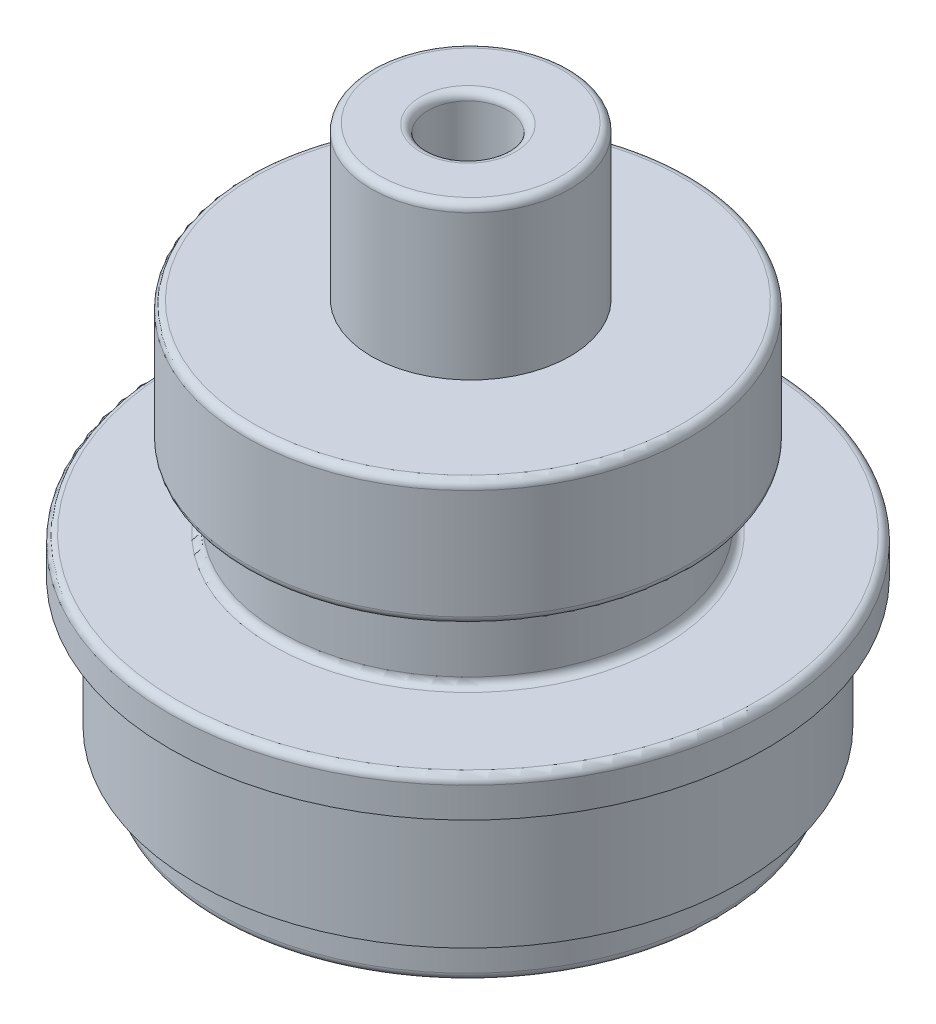
ISO-10303-21;
HEADER;
FILE_DESCRIPTION(('STEP AP214'),'2;1');
FILE_NAME('part.step','',(''),(''),'','','');
FILE_SCHEMA(('AUTOMOTIVE_DESIGN { 1 0 10303 214 1 1 1 1 }'));
ENDSEC;
DATA;
#1=APPLICATION_CONTEXT('core data for automotive mechanical design processes');
#2=APPLICATION_PROTOCOL_DEFINITION('international standard','automotive_design',2000,#1);
#3=PRODUCT_CONTEXT('',#1,'mechanical');
#4=PRODUCT('Part','Part','',(#3));
#5=PRODUCT_RELATED_PRODUCT_CATEGORY('part','',(#4));
#6=PRODUCT_DEFINITION_FORMATION('','',#4);
#7=PRODUCT_DEFINITION_CONTEXT('part definition',#1,'design');
#8=PRODUCT_DEFINITION('design','',#6,#7);
#9=PRODUCT_DEFINITION_SHAPE('','',#8);
#10=(LENGTH_UNIT() NAMED_UNIT(*) SI_UNIT(.MILLI.,.METRE.));
#11=(NAMED_UNIT(*) PLANE_ANGLE_UNIT() SI_UNIT($,.RADIAN.));
#12=(NAMED_UNIT(*) SI_UNIT($,.STERADIAN.) SOLID_ANGLE_UNIT());
#13=UNCERTAINTY_MEASURE_WITH_UNIT(LENGTH_MEASURE(1.E-05),#10,'distance_accuracy_value','');
#14=(GEOMETRIC_REPRESENTATION_CONTEXT(3) GLOBAL_UNCERTAINTY_ASSIGNED_CONTEXT((#13)) GLOBAL_UNIT_ASSIGNED_CONTEXT((#10,
#11,#12)) REPRESENTATION_CONTEXT('',''));
#15=CARTESIAN_POINT('',(0.,0.,0.));
#16=DIRECTION('',(0.,0.,1.));
#17=DIRECTION('',(1.,0.,0.));
#18=AXIS2_PLACEMENT_3D('',#15,#16,#17);
#19=CARTESIAN_POINT('',(0.,4.8514,0.));
#20=DIRECTION('',(0.,-1.,0.));
#21=DIRECTION('',(0.,0.,-1.));
#22=AXIS2_PLACEMENT_3D('',#19,#20,#21);
#23=CYLINDRICAL_SURFACE('',#22,38.1);
#24=CARTESIAN_POINT('',(0.,3.8514,0.));
#25=DIRECTION('',(0.,1.,0.));
#26=DIRECTION('',(0.,0.,1.));
#27=AXIS2_PLACEMENT_3D('',#24,#25,#26);
#28=CIRCLE('',#27,38.1);
#29=CARTESIAN_POINT('',(0.,3.8514,38.1));
#30=VERTEX_POINT('',#29);
#31=EDGE_CURVE('E83',#30,#30,#28,.F.);
#32=ORIENTED_EDGE('',*,*,#31,.T.);
#33=EDGE_LOOP('',(#32));
#34=FACE_BOUND('',#33,.T.);
#35=CARTESIAN_POINT('',(0.,0.,0.));
#36=DIRECTION('',(0.,1.,0.));
#37=DIRECTION('',(0.,0.,1.));
#38=AXIS2_PLACEMENT_3D('',#35,#36,#37);
#39=CIRCLE('',#38,38.1);
#40=CARTESIAN_POINT('',(0.,0.,38.1));
#41=VERTEX_POINT('',#40);
#42=EDGE_CURVE('E124',#41,#41,#39,.T.);
#43=ORIENTED_EDGE('',*,*,#42,.T.);
#44=EDGE_LOOP('',(#43));
#45=FACE_BOUND('',#44,.T.);
#46=ADVANCED_FACE('F43',(#34,#45),#23,.T.);
#47=CARTESIAN_POINT('',(0.,4.8514,0.));
#48=DIRECTION('',(0.,1.,0.));
#49=DIRECTION('',(0.,0.,1.));
#50=AXIS2_PLACEMENT_3D('',#47,#48,#49);
#51=PLANE('',#50);
#52=CARTESIAN_POINT('',(0.,4.8514,0.));
#53=DIRECTION('',(0.,1.,0.));
#54=DIRECTION('',(0.,0.,1.));
#55=AXIS2_PLACEMENT_3D('',#52,#53,#54);
#56=CIRCLE('',#55,37.1);
#57=CARTESIAN_POINT('',(0.,4.8514,37.1));
#58=VERTEX_POINT('',#57);
#59=EDGE_CURVE('E87',#58,#58,#56,.T.);
#60=ORIENTED_EDGE('',*,*,#59,.T.);
#61=EDGE_LOOP('',(#60));
#62=FACE_BOUND('',#61,.T.);
#63=CARTESIAN_POINT('',(0.,4.8514,0.));
#64=DIRECTION('',(0.,1.,0.));
#65=DIRECTION('',(0.,0.,1.));
#66=AXIS2_PLACEMENT_3D('',#63,#64,#65);
#67=CIRCLE('',#66,24.9776);
#68=CARTESIAN_POINT('',(0.,4.8514,24.9776));
#69=VERTEX_POINT('',#68);
#70=EDGE_CURVE('E91',#69,#69,#67,.F.);
#71=ORIENTED_EDGE('',*,*,#70,.T.);
#72=EDGE_LOOP('',(#71));
#73=FACE_BOUND('',#72,.T.);
#74=ADVANCED_FACE('F171',(#62,#73),#51,.T.);
#75=CARTESIAN_POINT('',(0.,0.,0.));
#76=DIRECTION('',(0.,1.,0.));
#77=DIRECTION('',(0.,0.,1.));
#78=AXIS2_PLACEMENT_3D('',#75,#76,#77);
#79=PLANE('',#78);
#80=CARTESIAN_POINT('',(0.,0.,0.));
#81=DIRECTION('',(0.,-1.,0.));
#82=DIRECTION('',(0.,0.,-1.));
#83=AXIS2_PLACEMENT_3D('',#80,#81,#82);
#84=CIRCLE('',#83,34.798);
#85=CARTESIAN_POINT('',(0.,0.,-34.798));
#86=VERTEX_POINT('',#85);
#87=EDGE_CURVE('E133',#86,#86,#84,.T.);
#88=ORIENTED_EDGE('',*,*,#87,.F.);
#89=EDGE_LOOP('',(#88));
#90=FACE_BOUND('',#89,.T.);
#91=ORIENTED_EDGE('',*,*,#42,.F.);
#92=EDGE_LOOP('',(#91));
#93=FACE_BOUND('',#92,.T.);
#94=ADVANCED_FACE('F177',(#90,#93),#79,.F.);
#95=CARTESIAN_POINT('',(0.,14.5796,0.));
#96=DIRECTION('',(0.,-1.,0.));
#97=DIRECTION('',(0.,0.,-1.));
#98=AXIS2_PLACEMENT_3D('',#95,#96,#97);
#99=CYLINDRICAL_SURFACE('',#98,23.9776);
#100=CARTESIAN_POINT('',(0.,5.8514,0.));
#101=DIRECTION('',(0.,1.,0.));
#102=DIRECTION('',(0.,0.,1.));
#103=AXIS2_PLACEMENT_3D('',#100,#101,#102);
#104=CIRCLE('',#103,23.9776);
#105=CARTESIAN_POINT('',(0.,5.8514,23.9776));
#106=VERTEX_POINT('',#105);
#107=EDGE_CURVE('E75',#106,#106,#104,.T.);
#108=ORIENTED_EDGE('',*,*,#107,.T.);
#109=EDGE_LOOP('',(#108));
#110=FACE_BOUND('',#109,.T.);
#111=CARTESIAN_POINT('',(0.,13.5796,0.));
#112=DIRECTION('',(0.,1.,0.));
#113=DIRECTION('',(0.,0.,1.));
#114=AXIS2_PLACEMENT_3D('',#111,#112,#113);
#115=CIRCLE('',#114,23.9776);
#116=CARTESIAN_POINT('',(0.,13.5796,23.9776));
#117=VERTEX_POINT('',#116);
#118=EDGE_CURVE('E79',#117,#117,#115,.F.);
#119=ORIENTED_EDGE('',*,*,#118,.T.);
#120=EDGE_LOOP('',(#119));
#121=FACE_BOUND('',#120,.T.);
#122=ADVANCED_FACE('F221',(#110,#121),#99,.T.);
#123=CARTESIAN_POINT('',(0.,30.5816,0.));
#124=DIRECTION('',(0.,-1.,0.));
#125=DIRECTION('',(0.,0.,-1.));
#126=AXIS2_PLACEMENT_3D('',#123,#124,#125);
#127=CYLINDRICAL_SURFACE('',#126,28.3464);
#128=CARTESIAN_POINT('',(0.,15.5796,0.));
#129=DIRECTION('',(0.,1.,0.));
#130=DIRECTION('',(0.,0.,1.));
#131=AXIS2_PLACEMENT_3D('',#128,#129,#130);
#132=CIRCLE('',#131,28.3464);
#133=CARTESIAN_POINT('',(0.,15.5796,28.3464));
#134=VERTEX_POINT('',#133);
#135=EDGE_CURVE('E56',#134,#134,#132,.T.);
#136=ORIENTED_EDGE('',*,*,#135,.T.);
#137=EDGE_LOOP('',(#136));
#138=FACE_BOUND('',#137,.T.);
#139=CARTESIAN_POINT('',(0.,29.5816,0.));
#140=DIRECTION('',(0.,1.,0.));
#141=DIRECTION('',(0.,0.,1.));
#142=AXIS2_PLACEMENT_3D('',#139,#140,#141);
#143=CIRCLE('',#142,28.3464);
#144=CARTESIAN_POINT('',(0.,29.5816,28.3464));
#145=VERTEX_POINT('',#144);
#146=EDGE_CURVE('E61',#145,#145,#143,.F.);
#147=ORIENTED_EDGE('',*,*,#146,.T.);
#148=EDGE_LOOP('',(#147));
#149=FACE_BOUND('',#148,.T.);
#150=ADVANCED_FACE('F218',(#138,#149),#127,.T.);
#151=CARTESIAN_POINT('',(0.,30.5816,0.));
#152=DIRECTION('',(0.,1.,0.));
#153=DIRECTION('',(0.,0.,1.));
#154=AXIS2_PLACEMENT_3D('',#151,#152,#153);
#155=PLANE('',#154);
#156=CARTESIAN_POINT('',(0.,30.5816,0.));
#157=DIRECTION('',(0.,1.,0.));
#158=DIRECTION('',(0.,0.,1.));
#159=AXIS2_PLACEMENT_3D('',#156,#157,#158);
#160=CIRCLE('',#159,27.3464);
#161=CARTESIAN_POINT('',(0.,30.5816,27.3464));
#162=VERTEX_POINT('',#161);
#163=EDGE_CURVE('E51',#162,#162,#160,.T.);
#164=ORIENTED_EDGE('',*,*,#163,.T.);
#165=EDGE_LOOP('',(#164));
#166=FACE_BOUND('',#165,.T.);
#167=CARTESIAN_POINT('',(0.,30.5816,-0.352964287565548));
#168=DIRECTION('',(0.,1.,0.));
#169=DIRECTION('',(0.,0.,1.));
#170=AXIS2_PLACEMENT_3D('',#167,#168,#169);
#171=CIRCLE('',#170,12.7);
#172=CARTESIAN_POINT('',(0.,30.5816,12.3470357124345));
#173=VERTEX_POINT('',#172);
#174=EDGE_CURVE('E128',#173,#173,#171,.T.);
#175=ORIENTED_EDGE('',*,*,#174,.F.);
#176=EDGE_LOOP('',(#175));
#177=FACE_BOUND('',#176,.T.);
#178=ADVANCED_FACE('F220',(#166,#177),#155,.T.);
#179=CARTESIAN_POINT('',(0.,14.5796,0.));
#180=DIRECTION('',(0.,1.,0.));
#181=DIRECTION('',(0.,0.,1.));
#182=AXIS2_PLACEMENT_3D('',#179,#180,#181);
#183=PLANE('',#182);
#184=CARTESIAN_POINT('',(0.,14.5796,0.));
#185=DIRECTION('',(0.,1.,0.));
#186=DIRECTION('',(0.,0.,1.));
#187=AXIS2_PLACEMENT_3D('',#184,#185,#186);
#188=CIRCLE('',#187,24.9776);
#189=CARTESIAN_POINT('',(0.,14.5796,24.9776));
#190=VERTEX_POINT('',#189);
#191=EDGE_CURVE('E67',#190,#190,#188,.T.);
#192=ORIENTED_EDGE('',*,*,#191,.T.);
#193=EDGE_LOOP('',(#192));
#194=FACE_BOUND('',#193,.T.);
#195=CARTESIAN_POINT('',(0.,14.5796,0.));
#196=DIRECTION('',(0.,1.,0.));
#197=DIRECTION('',(0.,0.,1.));
#198=AXIS2_PLACEMENT_3D('',#195,#196,#197);
#199=CIRCLE('',#198,27.3464);
#200=CARTESIAN_POINT('',(0.,14.5796,27.3464));
#201=VERTEX_POINT('',#200);
#202=EDGE_CURVE('E71',#201,#201,#199,.F.);
#203=ORIENTED_EDGE('',*,*,#202,.T.);
#204=EDGE_LOOP('',(#203));
#205=FACE_BOUND('',#204,.T.);
#206=ADVANCED_FACE('F228',(#194,#205),#183,.F.);
#207=CARTESIAN_POINT('',(0.,50.0888,-0.352964287565548));
#208=DIRECTION('',(0.,-1.,0.));
#209=DIRECTION('',(0.,0.,-1.));
#210=AXIS2_PLACEMENT_3D('',#207,#208,#209);
#211=CYLINDRICAL_SURFACE('',#210,12.7);
#212=CARTESIAN_POINT('',(0.,49.0888,-0.352964287565548));
#213=DIRECTION('',(0.,1.,0.));
#214=DIRECTION('',(0.,0.,1.));
#215=AXIS2_PLACEMENT_3D('',#212,#213,#214);
#216=CIRCLE('',#215,12.7);
#217=CARTESIAN_POINT('',(0.,49.0888,12.3470357124345));
#218=VERTEX_POINT('',#217);
#219=EDGE_CURVE('E10',#218,#218,#216,.F.);
#220=ORIENTED_EDGE('',*,*,#219,.T.);
#221=EDGE_LOOP('',(#220));
#222=FACE_BOUND('',#221,.T.);
#223=ORIENTED_EDGE('',*,*,#174,.T.);
#224=EDGE_LOOP('',(#223));
#225=FACE_BOUND('',#224,.T.);
#226=ADVANCED_FACE('F234',(#222,#225),#211,.T.);
#227=CARTESIAN_POINT('',(0.,50.0888,-0.352964287565548));
#228=DIRECTION('',(0.,1.,0.));
#229=DIRECTION('',(0.,0.,1.));
#230=AXIS2_PLACEMENT_3D('',#227,#228,#229);
#231=PLANE('',#230);
#232=CARTESIAN_POINT('',(0.,50.0888,0.));
#233=DIRECTION('',(0.,1.,0.));
#234=DIRECTION('',(0.,0.,1.));
#235=AXIS2_PLACEMENT_3D('',#232,#233,#234);
#236=CIRCLE('',#235,6.08);
#237=CARTESIAN_POINT('',(0.,50.0888,6.08));
#238=VERTEX_POINT('',#237);
#239=EDGE_CURVE('E95',#238,#238,#236,.F.);
#240=ORIENTED_EDGE('',*,*,#239,.T.);
#241=EDGE_LOOP('',(#240));
#242=FACE_BOUND('',#241,.T.);
#243=CARTESIAN_POINT('',(0.,50.0888,-0.352964287565548));
#244=DIRECTION('',(0.,1.,0.));
#245=DIRECTION('',(0.,0.,1.));
#246=AXIS2_PLACEMENT_3D('',#243,#244,#245);
#247=CIRCLE('',#246,11.7);
#248=CARTESIAN_POINT('',(0.,50.0888,11.3470357124345));
#249=VERTEX_POINT('',#248);
#250=EDGE_CURVE('E99',#249,#249,#247,.T.);
#251=ORIENTED_EDGE('',*,*,#250,.T.);
#252=EDGE_LOOP('',(#251));
#253=FACE_BOUND('',#252,.T.);
#254=ADVANCED_FACE('F239',(#242,#253),#231,.T.);
#255=CARTESIAN_POINT('',(0.,-16.51,0.));
#256=DIRECTION('',(0.,1.,0.));
#257=DIRECTION('',(0.,0.,1.));
#258=AXIS2_PLACEMENT_3D('',#255,#256,#257);
#259=CYLINDRICAL_SURFACE('',#258,34.798);
#260=CARTESIAN_POINT('',(0.,-16.51,0.));
#261=DIRECTION('',(0.,-1.,0.));
#262=DIRECTION('',(0.,0.,-1.));
#263=AXIS2_PLACEMENT_3D('',#260,#261,#262);
#264=CIRCLE('',#263,34.798);
#265=CARTESIAN_POINT('',(0.,-16.51,-34.798));
#266=VERTEX_POINT('',#265);
#267=EDGE_CURVE('E129',#266,#266,#264,.T.);
#268=ORIENTED_EDGE('',*,*,#267,.F.);
#269=EDGE_LOOP('',(#268));
#270=FACE_BOUND('',#269,.T.);
#271=ORIENTED_EDGE('',*,*,#87,.T.);
#272=EDGE_LOOP('',(#271));
#273=FACE_BOUND('',#272,.T.);
#274=ADVANCED_FACE('F242',(#270,#273),#259,.T.);
#275=CARTESIAN_POINT('',(0.,-16.51,0.));
#276=DIRECTION('',(0.,-1.,0.));
#277=DIRECTION('',(0.,0.,-1.));
#278=AXIS2_PLACEMENT_3D('',#275,#276,#277);
#279=PLANE('',#278);
#280=CARTESIAN_POINT('',(0.,-16.51,0.));
#281=DIRECTION('',(0.,-1.,0.));
#282=DIRECTION('',(0.,0.,-1.));
#283=AXIS2_PLACEMENT_3D('',#280,#281,#282);
#284=CIRCLE('',#283,32.0675);
#285=CARTESIAN_POINT('',(0.,-16.51,-32.0675));
#286=VERTEX_POINT('',#285);
#287=EDGE_CURVE('E123',#286,#286,#284,.T.);
#288=ORIENTED_EDGE('',*,*,#287,.F.);
#289=EDGE_LOOP('',(#288));
#290=FACE_BOUND('',#289,.T.);
#291=ORIENTED_EDGE('',*,*,#267,.T.);
#292=EDGE_LOOP('',(#291));
#293=FACE_BOUND('',#292,.T.);
#294=ADVANCED_FACE('F246',(#290,#293),#279,.T.);
#295=CARTESIAN_POINT('',(0.,-22.225,0.));
#296=DIRECTION('',(0.,1.,0.));
#297=DIRECTION('',(0.,0.,1.));
#298=AXIS2_PLACEMENT_3D('',#295,#296,#297);
#299=CYLINDRICAL_SURFACE('',#298,32.0675);
#300=CARTESIAN_POINT('',(0.,-21.225,0.));
#301=DIRECTION('',(0.,-1.,0.));
#302=DIRECTION('',(0.,0.,-1.));
#303=AXIS2_PLACEMENT_3D('',#300,#301,#302);
#304=CIRCLE('',#303,32.0675);
#305=CARTESIAN_POINT('',(0.,-21.225,-32.0675));
#306=VERTEX_POINT('',#305);
#307=EDGE_CURVE('E107',#306,#306,#304,.F.);
#308=ORIENTED_EDGE('',*,*,#307,.T.);
#309=EDGE_LOOP('',(#308));
#310=FACE_BOUND('',#309,.T.);
#311=ORIENTED_EDGE('',*,*,#287,.T.);
#312=EDGE_LOOP('',(#311));
#313=FACE_BOUND('',#312,.T.);
#314=ADVANCED_FACE('F250',(#310,#313),#299,.T.);
#315=CARTESIAN_POINT('',(0.,-22.225,0.));
#316=DIRECTION('',(0.,-1.,0.));
#317=DIRECTION('',(0.,0.,-1.));
#318=AXIS2_PLACEMENT_3D('',#315,#316,#317);
#319=PLANE('',#318);
#320=CARTESIAN_POINT('',(0.,-22.225,0.));
#321=DIRECTION('',(0.,-1.,0.));
#322=DIRECTION('',(0.,0.,-1.));
#323=AXIS2_PLACEMENT_3D('',#320,#321,#322);
#324=CIRCLE('',#323,20.05);
#325=CARTESIAN_POINT('',(0.,-22.225,-20.05));
#326=VERTEX_POINT('',#325);
#327=EDGE_CURVE('E111',#326,#326,#324,.F.);
#328=ORIENTED_EDGE('',*,*,#327,.T.);
#329=EDGE_LOOP('',(#328));
#330=FACE_BOUND('',#329,.T.);
#331=CARTESIAN_POINT('',(0.,-22.225,0.));
#332=DIRECTION('',(0.,-1.,0.));
#333=DIRECTION('',(0.,0.,-1.));
#334=AXIS2_PLACEMENT_3D('',#331,#332,#333);
#335=CIRCLE('',#334,31.0675);
#336=CARTESIAN_POINT('',(0.,-22.225,-31.0675));
#337=VERTEX_POINT('',#336);
#338=EDGE_CURVE('E115',#337,#337,#335,.T.);
#339=ORIENTED_EDGE('',*,*,#338,.T.);
#340=EDGE_LOOP('',(#339));
#341=FACE_BOUND('',#340,.T.);
#342=ADVANCED_FACE('F254',(#330,#341),#319,.T.);
#343=CARTESIAN_POINT('',(0.,15.875,0.));
#344=DIRECTION('',(0.,-1.,0.));
#345=DIRECTION('',(0.,0.,-1.));
#346=AXIS2_PLACEMENT_3D('',#343,#344,#345);
#347=CYLINDRICAL_SURFACE('',#346,19.05);
#348=CARTESIAN_POINT('',(0.,-21.225,0.));
#349=DIRECTION('',(0.,-1.,0.));
#350=DIRECTION('',(0.,0.,-1.));
#351=AXIS2_PLACEMENT_3D('',#348,#349,#350);
#352=CIRCLE('',#351,19.05);
#353=CARTESIAN_POINT('',(0.,-21.225,-19.05));
#354=VERTEX_POINT('',#353);
#355=EDGE_CURVE('E119',#354,#354,#352,.T.);
#356=CARTESIAN_POINT('',(0.,15.875,0.));
#357=DIRECTION('',(0.,-1.,0.));
#358=DIRECTION('',(0.,0.,-1.));
#359=AXIS2_PLACEMENT_3D('',#356,#357,#358);
#360=CIRCLE('',#359,19.05);
#361=CARTESIAN_POINT('',(0.,15.875,-19.05));
#362=VERTEX_POINT('',#361);
#363=EDGE_CURVE('E140',#362,#362,#360,.T.);
#364=CARTESIAN_POINT('',(0.,-21.225,-19.05));
#365=CARTESIAN_POINT('',(0.,-20.8385416666667,-19.05));
#366=CARTESIAN_POINT('',(0.,-20.4520833333333,-19.05));
#367=CARTESIAN_POINT('',(0.,-19.6791666666667,-19.05));
#368=CARTESIAN_POINT('',(0.,-19.2927083333333,-19.05));
#369=CARTESIAN_POINT('',(0.,-18.5197916666667,-19.05));
#370=CARTESIAN_POINT('',(0.,-18.1333333333333,-19.05));
#371=CARTESIAN_POINT('',(0.,-17.3604166666667,-19.05));
#372=CARTESIAN_POINT('',(0.,-16.9739583333333,-19.05));
#373=CARTESIAN_POINT('',(0.,-16.2010416666667,-19.05));
#374=CARTESIAN_POINT('',(0.,-15.8145833333333,-19.05));
#375=CARTESIAN_POINT('',(0.,-15.0416666666667,-19.05));
#376=CARTESIAN_POINT('',(0.,-14.6552083333333,-19.05));
#377=CARTESIAN_POINT('',(0.,-13.8822916666667,-19.05));
#378=CARTESIAN_POINT('',(0.,-13.4958333333333,-19.05));
#379=CARTESIAN_POINT('',(0.,-12.7229166666667,-19.05));
#380=CARTESIAN_POINT('',(0.,-12.3364583333333,-19.05));
#381=CARTESIAN_POINT('',(0.,-11.5635416666667,-19.05));
#382=CARTESIAN_POINT('',(0.,-11.1770833333333,-19.05));
#383=CARTESIAN_POINT('',(0.,-10.4041666666667,-19.05));
#384=CARTESIAN_POINT('',(0.,-10.0177083333333,-19.05));
#385=CARTESIAN_POINT('',(0.,-9.24479166666667,-19.05));
#386=CARTESIAN_POINT('',(0.,-8.85833333333333,-19.05));
#387=CARTESIAN_POINT('',(0.,-8.08541666666667,-19.05));
#388=CARTESIAN_POINT('',(0.,-7.69895833333334,-19.05));
#389=CARTESIAN_POINT('',(0.,-6.92604166666667,-19.05));
#390=CARTESIAN_POINT('',(0.,-6.53958333333333,-19.05));
#391=CARTESIAN_POINT('',(0.,-5.76666666666667,-19.05));
#392=CARTESIAN_POINT('',(0.,-5.38020833333333,-19.05));
#393=CARTESIAN_POINT('',(0.,-4.60729166666667,-19.05));
#394=CARTESIAN_POINT('',(0.,-4.22083333333333,-19.05));
#395=CARTESIAN_POINT('',(0.,-3.44791666666667,-19.05));
#396=CARTESIAN_POINT('',(0.,-3.06145833333333,-19.05));
#397=CARTESIAN_POINT('',(0.,-2.28854166666667,-19.05));
#398=CARTESIAN_POINT('',(0.,-1.90208333333333,-19.05));
#399=CARTESIAN_POINT('',(0.,-1.12916666666667,-19.05));
#400=CARTESIAN_POINT('',(0.,-0.742708333333332,-19.05));
#401=CARTESIAN_POINT('',(0.,0.030208333333334,-19.05));
#402=CARTESIAN_POINT('',(0.,0.416666666666667,-19.05));
#403=CARTESIAN_POINT('',(0.,1.18958333333333,-19.05));
#404=CARTESIAN_POINT('',(0.,1.57604166666667,-19.05));
#405=CARTESIAN_POINT('',(0.,2.34895833333333,-19.05));
#406=CARTESIAN_POINT('',(0.,2.73541666666667,-19.05));
#407=CARTESIAN_POINT('',(0.,3.50833333333333,-19.05));
#408=CARTESIAN_POINT('',(0.,3.89479166666667,-19.05));
#409=CARTESIAN_POINT('',(0.,4.66770833333333,-19.05));
#410=CARTESIAN_POINT('',(0.,5.05416666666667,-19.05));
#411=CARTESIAN_POINT('',(0.,5.82708333333333,-19.05));
#412=CARTESIAN_POINT('',(0.,6.21354166666667,-19.05));
#413=CARTESIAN_POINT('',(0.,6.98645833333333,-19.05));
#414=CARTESIAN_POINT('',(0.,7.37291666666667,-19.05));
#415=CARTESIAN_POINT('',(0.,8.14583333333333,-19.05));
#416=CARTESIAN_POINT('',(0.,8.53229166666667,-19.05));
#417=CARTESIAN_POINT('',(0.,9.30520833333333,-19.05));
#418=CARTESIAN_POINT('',(0.,9.69166666666667,-19.05));
#419=CARTESIAN_POINT('',(0.,10.4645833333333,-19.05));
#420=CARTESIAN_POINT('',(0.,10.8510416666667,-19.05));
#421=CARTESIAN_POINT('',(0.,11.6239583333333,-19.05));
#422=CARTESIAN_POINT('',(0.,12.0104166666667,-19.05));
#423=CARTESIAN_POINT('',(0.,12.7833333333333,-19.05));
#424=CARTESIAN_POINT('',(0.,13.1697916666667,-19.05));
#425=CARTESIAN_POINT('',(0.,13.9427083333333,-19.05));
#426=CARTESIAN_POINT('',(0.,14.3291666666667,-19.05));
#427=CARTESIAN_POINT('',(0.,15.1020833333333,-19.05));
#428=CARTESIAN_POINT('',(0.,15.4885416666667,-19.05));
#429=CARTESIAN_POINT('',(0.,15.875,-19.05));
#430=B_SPLINE_CURVE_WITH_KNOTS('',3,(#364,#365,#366,#367,#368,#369,#370,#371,#372,#373,#374,
#375,#376,#377,#378,#379,#380,#381,#382,#383,#384,#385,#386,#387,#388,#389,#390,#391,#392,#393,
#394,#395,#396,#397,#398,#399,#400,#401,#402,#403,#404,#405,#406,#407,#408,#409,#410,#411,#412,
#413,#414,#415,#416,#417,#418,#419,#420,#421,#422,#423,#424,#425,#426,#427,#428,#429),
.UNSPECIFIED.,.F.,.F.,(4,2,2,2,2,2,2,2,2,2,2,2,2,2,2,2,2,2,2,2,2,2,2,2,2,2,2,2,2,2,2,2,4),(0.,
1.159375,2.31875,3.478125,4.6375,5.796875,6.95625,8.115625,9.275,10.434375,11.59375,12.753125,
13.9125,15.071875,16.23125,17.390625,18.55,19.709375,20.86875,22.028125,23.1875,24.346875,
25.50625,26.665625,27.825,28.984375,30.14375,31.303125,32.4625,33.621875,34.78125,35.940625,
37.1),.UNSPECIFIED.);
#431=EDGE_CURVE('BSEAM167',#354,#362,#430,.T.);
#432=ORIENTED_EDGE('',*,*,#355,.T.);
#433=ORIENTED_EDGE('',*,*,#363,.F.);
#434=ORIENTED_EDGE('',*,*,#431,.T.);
#435=ORIENTED_EDGE('',*,*,#431,.F.);
#436=EDGE_LOOP('',(#432,#434,#433,#435));
#437=FACE_BOUND('',#436,.T.);
#438=ADVANCED_FACE('F167',(#437),#347,.F.);
#439=CARTESIAN_POINT('',(0.,15.875,0.));
#440=DIRECTION('',(0.,-1.,0.));
#441=DIRECTION('',(0.,0.,-1.));
#442=AXIS2_PLACEMENT_3D('',#439,#440,#441);
#443=PLANE('',#442);
#444=ORIENTED_EDGE('',*,*,#363,.T.);
#445=EDGE_LOOP('',(#444));
#446=FACE_BOUND('',#445,.T.);
#447=ADVANCED_FACE('F156',(#446),#443,.T.);
#448=CARTESIAN_POINT('',(0.,20.3708,0.));
#449=DIRECTION('',(0.,1.,0.));
#450=DIRECTION('',(0.,0.,1.));
#451=AXIS2_PLACEMENT_3D('',#448,#449,#450);
#452=CYLINDRICAL_SURFACE('',#451,5.08);
#453=CARTESIAN_POINT('',(0.,49.0888,0.));
#454=DIRECTION('',(0.,1.,0.));
#455=DIRECTION('',(0.,0.,1.));
#456=AXIS2_PLACEMENT_3D('',#453,#454,#455);
#457=CIRCLE('',#456,5.08);
#458=CARTESIAN_POINT('',(0.,49.0888,5.08));
#459=VERTEX_POINT('',#458);
#460=EDGE_CURVE('E103',#459,#459,#457,.T.);
#461=ORIENTED_EDGE('',*,*,#460,.T.);
#462=EDGE_LOOP('',(#461));
#463=FACE_BOUND('',#462,.T.);
#464=CARTESIAN_POINT('',(0.,20.3708,0.));
#465=DIRECTION('',(0.,1.,0.));
#466=DIRECTION('',(0.,0.,1.));
#467=AXIS2_PLACEMENT_3D('',#464,#465,#466);
#468=CIRCLE('',#467,5.08);
#469=CARTESIAN_POINT('',(0.,20.3708,5.08));
#470=VERTEX_POINT('',#469);
#471=EDGE_CURVE('E147',#470,#470,#468,.T.);
#472=ORIENTED_EDGE('',*,*,#471,.F.);
#473=EDGE_LOOP('',(#472));
#474=FACE_BOUND('',#473,.T.);
#475=ADVANCED_FACE('F154',(#463,#474),#452,.F.);
#476=CARTESIAN_POINT('',(0.,20.3708,0.));
#477=DIRECTION('',(0.,1.,0.));
#478=DIRECTION('',(0.,0.,1.));
#479=AXIS2_PLACEMENT_3D('',#476,#477,#478);
#480=PLANE('',#479);
#481=ORIENTED_EDGE('',*,*,#471,.T.);
#482=EDGE_LOOP('',(#481));
#483=FACE_BOUND('',#482,.T.);
#484=ADVANCED_FACE('F152',(#483),#480,.T.);
#485=CARTESIAN_POINT('',(0.,-21.225,0.));
#486=DIRECTION('',(0.,-1.,0.));
#487=DIRECTION('',(0.,0.,-1.));
#488=AXIS2_PLACEMENT_3D('',#485,#486,#487);
#489=TOROIDAL_SURFACE('',#488,20.05,1.);
#490=ORIENTED_EDGE('',*,*,#327,.F.);
#491=EDGE_LOOP('',(#490));
#492=FACE_BOUND('',#491,.T.);
#493=ORIENTED_EDGE('',*,*,#355,.F.);
#494=EDGE_LOOP('',(#493));
#495=FACE_BOUND('',#494,.T.);
#496=ADVANCED_FACE('F164',(#492,#495),#489,.T.);
#497=CARTESIAN_POINT('',(0.,-21.225,0.));
#498=DIRECTION('',(0.,-1.,0.));
#499=DIRECTION('',(0.,0.,-1.));
#500=AXIS2_PLACEMENT_3D('',#497,#498,#499);
#501=TOROIDAL_SURFACE('',#500,31.0675,1.);
#502=ORIENTED_EDGE('',*,*,#307,.F.);
#503=EDGE_LOOP('',(#502));
#504=FACE_BOUND('',#503,.T.);
#505=ORIENTED_EDGE('',*,*,#338,.F.);
#506=EDGE_LOOP('',(#505));
#507=FACE_BOUND('',#506,.T.);
#508=ADVANCED_FACE('F184',(#504,#507),#501,.T.);
#509=CARTESIAN_POINT('',(0.,49.0888,0.));
#510=DIRECTION('',(0.,1.,0.));
#511=DIRECTION('',(0.,0.,1.));
#512=AXIS2_PLACEMENT_3D('',#509,#510,#511);
#513=TOROIDAL_SURFACE('',#512,6.08,1.);
#514=ORIENTED_EDGE('',*,*,#239,.F.);
#515=EDGE_LOOP('',(#514));
#516=FACE_BOUND('',#515,.T.);
#517=ORIENTED_EDGE('',*,*,#460,.F.);
#518=EDGE_LOOP('',(#517));
#519=FACE_BOUND('',#518,.T.);
#520=ADVANCED_FACE('F188',(#516,#519),#513,.T.);
#521=CARTESIAN_POINT('',(0.,3.8514,0.));
#522=DIRECTION('',(0.,1.,0.));
#523=DIRECTION('',(0.,0.,1.));
#524=AXIS2_PLACEMENT_3D('',#521,#522,#523);
#525=TOROIDAL_SURFACE('',#524,37.1,1.);
#526=ORIENTED_EDGE('',*,*,#31,.F.);
#527=EDGE_LOOP('',(#526));
#528=FACE_BOUND('',#527,.T.);
#529=ORIENTED_EDGE('',*,*,#59,.F.);
#530=EDGE_LOOP('',(#529));
#531=FACE_BOUND('',#530,.T.);
#532=ADVANCED_FACE('F192',(#528,#531),#525,.T.);
#533=CARTESIAN_POINT('',(0.,5.8514,0.));
#534=DIRECTION('',(0.,1.,0.));
#535=DIRECTION('',(0.,0.,1.));
#536=AXIS2_PLACEMENT_3D('',#533,#534,#535);
#537=TOROIDAL_SURFACE('',#536,24.9776,1.);
#538=ORIENTED_EDGE('',*,*,#70,.F.);
#539=EDGE_LOOP('',(#538));
#540=FACE_BOUND('',#539,.T.);
#541=ORIENTED_EDGE('',*,*,#107,.F.);
#542=EDGE_LOOP('',(#541));
#543=FACE_BOUND('',#542,.T.);
#544=ADVANCED_FACE('F196',(#540,#543),#537,.F.);
#545=CARTESIAN_POINT('',(0.,13.5796,0.));
#546=DIRECTION('',(0.,1.,0.));
#547=DIRECTION('',(0.,0.,1.));
#548=AXIS2_PLACEMENT_3D('',#545,#546,#547);
#549=TOROIDAL_SURFACE('',#548,24.9776,1.);
#550=ORIENTED_EDGE('',*,*,#118,.F.);
#551=EDGE_LOOP('',(#550));
#552=FACE_BOUND('',#551,.T.);
#553=ORIENTED_EDGE('',*,*,#191,.F.);
#554=EDGE_LOOP('',(#553));
#555=FACE_BOUND('',#554,.T.);
#556=ADVANCED_FACE('F200',(#552,#555),#549,.F.);
#557=CARTESIAN_POINT('',(0.,15.5796,0.));
#558=DIRECTION('',(0.,1.,0.));
#559=DIRECTION('',(0.,0.,1.));
#560=AXIS2_PLACEMENT_3D('',#557,#558,#559);
#561=TOROIDAL_SURFACE('',#560,27.3464,1.);
#562=ORIENTED_EDGE('',*,*,#202,.F.);
#563=EDGE_LOOP('',(#562));
#564=FACE_BOUND('',#563,.T.);
#565=ORIENTED_EDGE('',*,*,#135,.F.);
#566=EDGE_LOOP('',(#565));
#567=FACE_BOUND('',#566,.T.);
#568=ADVANCED_FACE('F204',(#564,#567),#561,.T.);
#569=CARTESIAN_POINT('',(0.,29.5816,0.));
#570=DIRECTION('',(0.,1.,0.));
#571=DIRECTION('',(0.,0.,1.));
#572=AXIS2_PLACEMENT_3D('',#569,#570,#571);
#573=TOROIDAL_SURFACE('',#572,27.3464,1.);
#574=ORIENTED_EDGE('',*,*,#146,.F.);
#575=EDGE_LOOP('',(#574));
#576=FACE_BOUND('',#575,.T.);
#577=ORIENTED_EDGE('',*,*,#163,.F.);
#578=EDGE_LOOP('',(#577));
#579=FACE_BOUND('',#578,.T.);
#580=ADVANCED_FACE('F207',(#576,#579),#573,.T.);
#581=CARTESIAN_POINT('',(0.,49.0888,-0.352964287565548));
#582=DIRECTION('',(0.,1.,0.));
#583=DIRECTION('',(0.,0.,1.));
#584=AXIS2_PLACEMENT_3D('',#581,#582,#583);
#585=TOROIDAL_SURFACE('',#584,11.7,1.);
#586=ORIENTED_EDGE('',*,*,#219,.F.);
#587=EDGE_LOOP('',(#586));
#588=FACE_BOUND('',#587,.T.);
#589=ORIENTED_EDGE('',*,*,#250,.F.);
#590=EDGE_LOOP('',(#589));
#591=FACE_BOUND('',#590,.T.);
#592=ADVANCED_FACE('F45',(#588,#591),#585,.T.);
#593=CLOSED_SHELL('',(#46,#74,#94,#122,#150,#178,#206,#226,#254,#274,#294,#314,#342,#438,#447,
#475,#484,#496,#508,#520,#532,#544,#556,#568,#580,#592));
#594=MANIFOLD_SOLID_BREP('B2',#593);
#595=ADVANCED_BREP_SHAPE_REPRESENTATION('',(#18,#594),#14);
#596=SHAPE_DEFINITION_REPRESENTATION(#9,#595);
ENDSEC;
END-ISO-10303-21;
